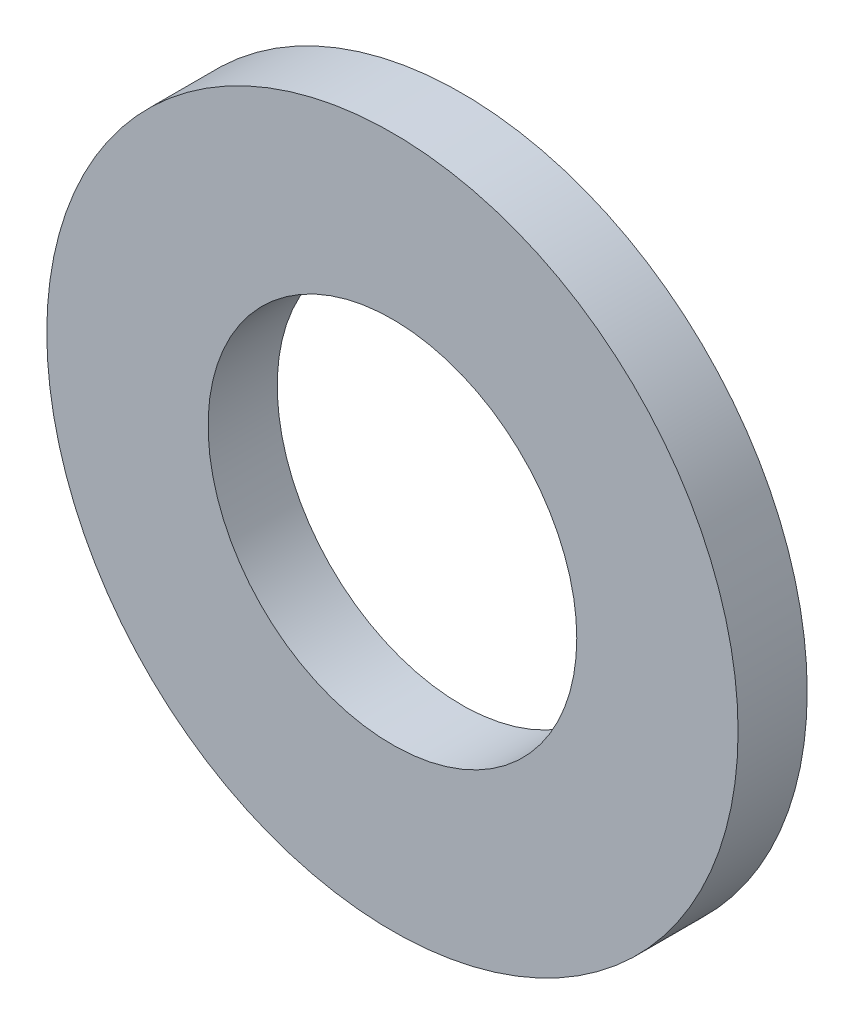
ISO-10303-21;
HEADER;
FILE_DESCRIPTION(('STEP AP214'),'2;1');
FILE_NAME('part.step','',(''),(''),'','','');
FILE_SCHEMA(('AUTOMOTIVE_DESIGN { 1 0 10303 214 1 1 1 1 }'));
ENDSEC;
DATA;
#1=APPLICATION_CONTEXT('core data for automotive mechanical design processes');
#2=APPLICATION_PROTOCOL_DEFINITION('international standard','automotive_design',2000,#1);
#3=PRODUCT_CONTEXT('',#1,'mechanical');
#4=PRODUCT('Part','Part','',(#3));
#5=PRODUCT_RELATED_PRODUCT_CATEGORY('part','',(#4));
#6=PRODUCT_DEFINITION_FORMATION('','',#4);
#7=PRODUCT_DEFINITION_CONTEXT('part definition',#1,'design');
#8=PRODUCT_DEFINITION('design','',#6,#7);
#9=PRODUCT_DEFINITION_SHAPE('','',#8);
#10=(LENGTH_UNIT() NAMED_UNIT(*) SI_UNIT(.MILLI.,.METRE.));
#11=(NAMED_UNIT(*) PLANE_ANGLE_UNIT() SI_UNIT($,.RADIAN.));
#12=(NAMED_UNIT(*) SI_UNIT($,.STERADIAN.) SOLID_ANGLE_UNIT());
#13=UNCERTAINTY_MEASURE_WITH_UNIT(LENGTH_MEASURE(1.E-05),#10,'distance_accuracy_value','');
#14=(GEOMETRIC_REPRESENTATION_CONTEXT(3) GLOBAL_UNCERTAINTY_ASSIGNED_CONTEXT((#13)) GLOBAL_UNIT_ASSIGNED_CONTEXT((#10,
#11,#12)) REPRESENTATION_CONTEXT('',''));
#15=CARTESIAN_POINT('',(0.,0.,0.));
#16=DIRECTION('',(0.,0.,1.));
#17=DIRECTION('',(1.,0.,0.));
#18=AXIS2_PLACEMENT_3D('',#15,#16,#17);
#19=CARTESIAN_POINT('',(0.,0.,1.2));
#20=DIRECTION('',(0.,0.,1.));
#21=DIRECTION('',(1.,0.,0.));
#22=AXIS2_PLACEMENT_3D('',#19,#20,#21);
#23=PLANE('',#22);
#24=CARTESIAN_POINT('',(0.,0.,1.2));
#25=DIRECTION('',(0.,0.,1.));
#26=DIRECTION('',(1.,0.,0.));
#27=AXIS2_PLACEMENT_3D('',#24,#25,#26);
#28=CIRCLE('',#27,6.);
#29=CARTESIAN_POINT('',(6.,0.,1.2));
#30=VERTEX_POINT('',#29);
#31=EDGE_CURVE('E10',#30,#30,#28,.T.);
#32=ORIENTED_EDGE('',*,*,#31,.T.);
#33=EDGE_LOOP('',(#32));
#34=FACE_BOUND('',#33,.T.);
#35=CARTESIAN_POINT('',(0.,0.,1.2));
#36=DIRECTION('',(0.,0.,1.));
#37=DIRECTION('',(1.,0.,0.));
#38=AXIS2_PLACEMENT_3D('',#35,#36,#37);
#39=CIRCLE('',#38,3.2);
#40=CARTESIAN_POINT('',(3.2,0.,1.2));
#41=VERTEX_POINT('',#40);
#42=EDGE_CURVE('E42',#41,#41,#39,.T.);
#43=ORIENTED_EDGE('',*,*,#42,.F.);
#44=EDGE_LOOP('',(#43));
#45=FACE_BOUND('',#44,.T.);
#46=ADVANCED_FACE('F31',(#34,#45),#23,.T.);
#47=CARTESIAN_POINT('',(0.,0.,0.));
#48=DIRECTION('',(0.,0.,1.));
#49=DIRECTION('',(1.,0.,0.));
#50=AXIS2_PLACEMENT_3D('',#47,#48,#49);
#51=PLANE('',#50);
#52=CARTESIAN_POINT('',(0.,0.,0.));
#53=DIRECTION('',(0.,0.,1.));
#54=DIRECTION('',(1.,0.,0.));
#55=AXIS2_PLACEMENT_3D('',#52,#53,#54);
#56=CIRCLE('',#55,6.);
#57=CARTESIAN_POINT('',(6.,0.,0.));
#58=VERTEX_POINT('',#57);
#59=EDGE_CURVE('E35',#58,#58,#56,.T.);
#60=ORIENTED_EDGE('',*,*,#59,.F.);
#61=EDGE_LOOP('',(#60));
#62=FACE_BOUND('',#61,.T.);
#63=CARTESIAN_POINT('',(0.,0.,0.));
#64=DIRECTION('',(0.,0.,1.));
#65=DIRECTION('',(1.,0.,0.));
#66=AXIS2_PLACEMENT_3D('',#63,#64,#65);
#67=CIRCLE('',#66,3.2);
#68=CARTESIAN_POINT('',(3.2,0.,0.));
#69=VERTEX_POINT('',#68);
#70=EDGE_CURVE('E44',#69,#69,#67,.T.);
#71=ORIENTED_EDGE('',*,*,#70,.T.);
#72=EDGE_LOOP('',(#71));
#73=FACE_BOUND('',#72,.T.);
#74=ADVANCED_FACE('F54',(#62,#73),#51,.F.);
#75=CARTESIAN_POINT('',(0.,0.,1.2));
#76=DIRECTION('',(0.,0.,-1.));
#77=DIRECTION('',(-1.,0.,0.));
#78=AXIS2_PLACEMENT_3D('',#75,#76,#77);
#79=CYLINDRICAL_SURFACE('',#78,6.);
#80=ORIENTED_EDGE('',*,*,#31,.F.);
#81=EDGE_LOOP('',(#80));
#82=FACE_BOUND('',#81,.T.);
#83=ORIENTED_EDGE('',*,*,#59,.T.);
#84=EDGE_LOOP('',(#83));
#85=FACE_BOUND('',#84,.T.);
#86=ADVANCED_FACE('F33',(#82,#85),#79,.T.);
#87=CARTESIAN_POINT('',(0.,0.,1.2));
#88=DIRECTION('',(0.,0.,-1.));
#89=DIRECTION('',(-1.,0.,0.));
#90=AXIS2_PLACEMENT_3D('',#87,#88,#89);
#91=CYLINDRICAL_SURFACE('',#90,3.2);
#92=ORIENTED_EDGE('',*,*,#42,.T.);
#93=EDGE_LOOP('',(#92));
#94=FACE_BOUND('',#93,.T.);
#95=ORIENTED_EDGE('',*,*,#70,.F.);
#96=EDGE_LOOP('',(#95));
#97=FACE_BOUND('',#96,.T.);
#98=ADVANCED_FACE('F50',(#94,#97),#91,.F.);
#99=CLOSED_SHELL('',(#46,#74,#86,#98));
#100=MANIFOLD_SOLID_BREP('B2',#99);
#101=ADVANCED_BREP_SHAPE_REPRESENTATION('',(#18,#100),#14);
#102=SHAPE_DEFINITION_REPRESENTATION(#9,#101);
ENDSEC;
END-ISO-10303-21;
